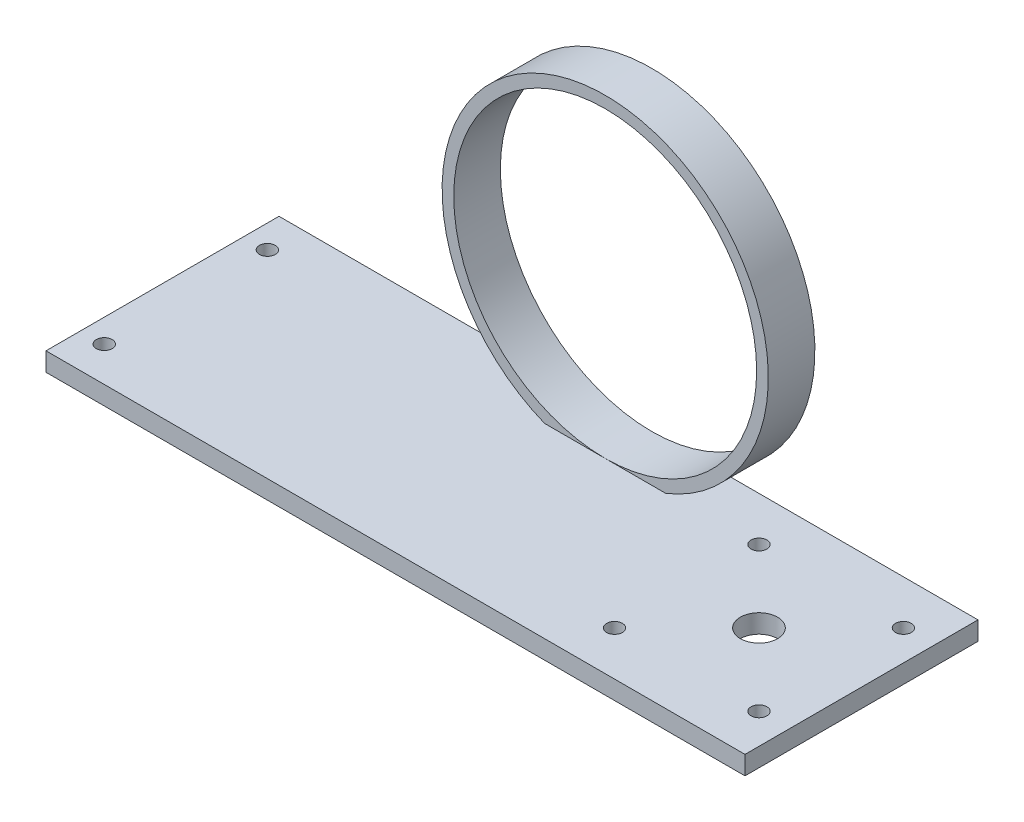
ISO-10303-21;
HEADER;
FILE_DESCRIPTION(('STEP AP214'),'2;1');
FILE_NAME('part.step','',(''),(''),'','','');
FILE_SCHEMA(('AUTOMOTIVE_DESIGN { 1 0 10303 214 1 1 1 1 }'));
ENDSEC;
DATA;
#1=APPLICATION_CONTEXT('core data for automotive mechanical design processes');
#2=APPLICATION_PROTOCOL_DEFINITION('international standard','automotive_design',2000,#1);
#3=PRODUCT_CONTEXT('',#1,'mechanical');
#4=PRODUCT('Part','Part','',(#3));
#5=PRODUCT_RELATED_PRODUCT_CATEGORY('part','',(#4));
#6=PRODUCT_DEFINITION_FORMATION('','',#4);
#7=PRODUCT_DEFINITION_CONTEXT('part definition',#1,'design');
#8=PRODUCT_DEFINITION('design','',#6,#7);
#9=PRODUCT_DEFINITION_SHAPE('','',#8);
#10=(LENGTH_UNIT() NAMED_UNIT(*) SI_UNIT(.MILLI.,.METRE.));
#11=(NAMED_UNIT(*) PLANE_ANGLE_UNIT() SI_UNIT($,.RADIAN.));
#12=(NAMED_UNIT(*) SI_UNIT($,.STERADIAN.) SOLID_ANGLE_UNIT());
#13=UNCERTAINTY_MEASURE_WITH_UNIT(LENGTH_MEASURE(1.E-05),#10,'distance_accuracy_value','');
#14=(GEOMETRIC_REPRESENTATION_CONTEXT(3) GLOBAL_UNCERTAINTY_ASSIGNED_CONTEXT((#13)) GLOBAL_UNIT_ASSIGNED_CONTEXT((#10,
#11,#12)) REPRESENTATION_CONTEXT('',''));
#15=CARTESIAN_POINT('',(0.,0.,0.));
#16=DIRECTION('',(0.,0.,1.));
#17=DIRECTION('',(1.,0.,0.));
#18=AXIS2_PLACEMENT_3D('',#15,#16,#17);
#19=CARTESIAN_POINT('',(0.,0.,10.));
#20=DIRECTION('',(0.,0.,1.));
#21=DIRECTION('',(1.,0.,0.));
#22=AXIS2_PLACEMENT_3D('',#19,#20,#21);
#23=PLANE('',#22);
#24=DIRECTION('',(-1.,0.,0.));
#25=VECTOR('',#24,1.);
#26=CARTESIAN_POINT('',(0.,-32.5,10.));
#27=LINE('',#26,#25);
#28=CARTESIAN_POINT('',(12.9903810567666,-32.5,10.));
#29=VERTEX_POINT('',#28);
#30=CARTESIAN_POINT('',(0.,-32.5,10.));
#31=VERTEX_POINT('',#30);
#32=EDGE_CURVE('E60',#29,#31,#27,.T.);
#33=ORIENTED_EDGE('',*,*,#32,.F.);
#34=CARTESIAN_POINT('',(0.,0.,10.));
#35=DIRECTION('',(0.,0.,1.));
#36=DIRECTION('',(1.,0.,0.));
#37=AXIS2_PLACEMENT_3D('',#34,#35,#36);
#38=CIRCLE('',#37,35.);
#39=CARTESIAN_POINT('',(-12.9903810567666,-32.5,10.));
#40=VERTEX_POINT('',#39);
#41=EDGE_CURVE('E11',#29,#40,#38,.T.);
#42=ORIENTED_EDGE('',*,*,#41,.T.);
#43=EDGE_CURVE('E139',#31,#40,#27,.T.);
#44=ORIENTED_EDGE('',*,*,#43,.F.);
#45=CARTESIAN_POINT('',(0.,0.,10.));
#46=DIRECTION('',(0.,0.,1.));
#47=DIRECTION('',(1.,0.,0.));
#48=AXIS2_PLACEMENT_3D('',#45,#46,#47);
#49=CIRCLE('',#48,32.5);
#50=EDGE_CURVE('E149',#31,#31,#49,.T.);
#51=ORIENTED_EDGE('',*,*,#50,.F.);
#52=EDGE_LOOP('',(#33,#42,#44,#51));
#53=FACE_BOUND('',#52,.T.);
#54=ADVANCED_FACE('F39',(#53),#23,.T.);
#55=CARTESIAN_POINT('',(0.,0.,0.));
#56=DIRECTION('',(0.,0.,1.));
#57=DIRECTION('',(1.,0.,0.));
#58=AXIS2_PLACEMENT_3D('',#55,#56,#57);
#59=PLANE('',#58);
#60=CARTESIAN_POINT('',(0.,0.,0.));
#61=DIRECTION('',(0.,0.,1.));
#62=DIRECTION('',(1.,0.,0.));
#63=AXIS2_PLACEMENT_3D('',#60,#61,#62);
#64=CIRCLE('',#63,32.5);
#65=CARTESIAN_POINT('',(32.5,0.,0.));
#66=VERTEX_POINT('',#65);
#67=EDGE_CURVE('E152',#66,#66,#64,.T.);
#68=ORIENTED_EDGE('',*,*,#67,.T.);
#69=EDGE_LOOP('',(#68));
#70=FACE_BOUND('',#69,.T.);
#71=CARTESIAN_POINT('',(0.,0.,0.));
#72=DIRECTION('',(0.,0.,1.));
#73=DIRECTION('',(1.,0.,0.));
#74=AXIS2_PLACEMENT_3D('',#71,#72,#73);
#75=CIRCLE('',#74,35.);
#76=CARTESIAN_POINT('',(12.9903810567666,-32.5,0.));
#77=VERTEX_POINT('',#76);
#78=CARTESIAN_POINT('',(-12.9903810567666,-32.5,0.));
#79=VERTEX_POINT('',#78);
#80=EDGE_CURVE('E43',#77,#79,#75,.T.);
#81=ORIENTED_EDGE('',*,*,#80,.F.);
#82=DIRECTION('',(1.,0.,0.));
#83=VECTOR('',#82,1.);
#84=CARTESIAN_POINT('',(0.,-32.5,0.));
#85=LINE('',#84,#83);
#86=CARTESIAN_POINT('',(70.,-32.5,0.));
#87=VERTEX_POINT('',#86);
#88=EDGE_CURVE('E131',#77,#87,#85,.T.);
#89=ORIENTED_EDGE('',*,*,#88,.T.);
#90=DIRECTION('',(0.,-1.,0.));
#91=VECTOR('',#90,1.);
#92=CARTESIAN_POINT('',(70.,-32.5,0.));
#93=LINE('',#92,#91);
#94=CARTESIAN_POINT('',(70.,-36.5,0.));
#95=VERTEX_POINT('',#94);
#96=EDGE_CURVE('E115',#87,#95,#93,.T.);
#97=ORIENTED_EDGE('',*,*,#96,.T.);
#98=DIRECTION('',(-1.,0.,0.));
#99=VECTOR('',#98,1.);
#100=CARTESIAN_POINT('',(70.,-36.5,0.));
#101=LINE('',#100,#99);
#102=CARTESIAN_POINT('',(-80.,-36.5,0.));
#103=VERTEX_POINT('',#102);
#104=EDGE_CURVE('E133',#95,#103,#101,.T.);
#105=ORIENTED_EDGE('',*,*,#104,.T.);
#106=DIRECTION('',(0.,1.,0.));
#107=VECTOR('',#106,1.);
#108=CARTESIAN_POINT('',(-80.,-32.5,0.));
#109=LINE('',#108,#107);
#110=CARTESIAN_POINT('',(-80.,-32.5,0.));
#111=VERTEX_POINT('',#110);
#112=EDGE_CURVE('E109',#103,#111,#109,.T.);
#113=ORIENTED_EDGE('',*,*,#112,.T.);
#114=EDGE_CURVE('E128',#111,#79,#85,.T.);
#115=ORIENTED_EDGE('',*,*,#114,.T.);
#116=EDGE_LOOP('',(#81,#89,#97,#105,#113,#115));
#117=FACE_BOUND('',#116,.T.);
#118=ADVANCED_FACE('F168',(#70,#117),#59,.F.);
#119=CARTESIAN_POINT('',(0.,0.,10.));
#120=DIRECTION('',(0.,0.,-1.));
#121=DIRECTION('',(-1.,0.,0.));
#122=AXIS2_PLACEMENT_3D('',#119,#120,#121);
#123=CYLINDRICAL_SURFACE('',#122,35.);
#124=ORIENTED_EDGE('',*,*,#41,.F.);
#125=DIRECTION('',(0.,0.,-1.));
#126=VECTOR('',#125,1.);
#127=CARTESIAN_POINT('',(12.9903810567666,-32.5,10.));
#128=LINE('',#127,#126);
#129=EDGE_CURVE('E147',#29,#77,#128,.T.);
#130=ORIENTED_EDGE('',*,*,#129,.T.);
#131=ORIENTED_EDGE('',*,*,#80,.T.);
#132=DIRECTION('',(0.,0.,-1.));
#133=VECTOR('',#132,1.);
#134=CARTESIAN_POINT('',(-12.9903810567666,-32.5,10.));
#135=LINE('',#134,#133);
#136=EDGE_CURVE('E145',#79,#40,#135,.F.);
#137=ORIENTED_EDGE('',*,*,#136,.T.);
#138=EDGE_LOOP('',(#124,#130,#131,#137));
#139=FACE_BOUND('',#138,.T.);
#140=ADVANCED_FACE('F41',(#139),#123,.T.);
#141=CARTESIAN_POINT('',(0.,0.,10.));
#142=DIRECTION('',(0.,0.,-1.));
#143=DIRECTION('',(-1.,0.,0.));
#144=AXIS2_PLACEMENT_3D('',#141,#142,#143);
#145=CYLINDRICAL_SURFACE('',#144,32.5);
#146=ORIENTED_EDGE('',*,*,#67,.F.);
#147=EDGE_LOOP('',(#146));
#148=FACE_BOUND('',#147,.T.);
#149=ORIENTED_EDGE('',*,*,#50,.T.);
#150=EDGE_LOOP('',(#149));
#151=FACE_BOUND('',#150,.T.);
#152=ADVANCED_FACE('F157',(#148,#151),#145,.F.);
#153=CARTESIAN_POINT('',(0.,-32.5,50.));
#154=DIRECTION('',(0.,1.,0.));
#155=DIRECTION('',(-1.,0.,0.));
#156=AXIS2_PLACEMENT_3D('',#153,#154,#155);
#157=PLANE('',#156);
#158=CARTESIAN_POINT('',(-75.,-32.5,42.5));
#159=DIRECTION('',(0.,1.,0.));
#160=DIRECTION('',(-1.,0.,0.));
#161=AXIS2_PLACEMENT_3D('',#158,#159,#160);
#162=CIRCLE('',#161,1.7);
#163=CARTESIAN_POINT('',(-76.7,-32.5,42.5));
#164=VERTEX_POINT('',#163);
#165=EDGE_CURVE('E228',#164,#164,#162,.F.);
#166=ORIENTED_EDGE('',*,*,#165,.T.);
#167=EDGE_LOOP('',(#166));
#168=FACE_BOUND('',#167,.T.);
#169=CARTESIAN_POINT('',(-75.,-32.5,7.49999999999999));
#170=DIRECTION('',(0.,1.,0.));
#171=DIRECTION('',(-1.,0.,0.));
#172=AXIS2_PLACEMENT_3D('',#169,#170,#171);
#173=CIRCLE('',#172,1.7);
#174=CARTESIAN_POINT('',(-76.7,-32.5,7.49999999999999));
#175=VERTEX_POINT('',#174);
#176=EDGE_CURVE('E236',#175,#175,#173,.F.);
#177=ORIENTED_EDGE('',*,*,#176,.T.);
#178=EDGE_LOOP('',(#177));
#179=FACE_BOUND('',#178,.T.);
#180=CARTESIAN_POINT('',(63.5,-32.5,9.500000000001));
#181=DIRECTION('',(0.,1.,0.));
#182=DIRECTION('',(-1.,0.,0.));
#183=AXIS2_PLACEMENT_3D('',#180,#181,#182);
#184=CIRCLE('',#183,1.7);
#185=CARTESIAN_POINT('',(61.8,-32.5,9.500000000001));
#186=VERTEX_POINT('',#185);
#187=EDGE_CURVE('E247',#186,#186,#184,.F.);
#188=ORIENTED_EDGE('',*,*,#187,.T.);
#189=EDGE_LOOP('',(#188));
#190=FACE_BOUND('',#189,.T.);
#191=CARTESIAN_POINT('',(32.5,-32.5,40.499999999999));
#192=DIRECTION('',(0.,1.,0.));
#193=DIRECTION('',(-1.,0.,0.));
#194=AXIS2_PLACEMENT_3D('',#191,#192,#193);
#195=CIRCLE('',#194,1.7);
#196=CARTESIAN_POINT('',(30.8,-32.5,40.499999999999));
#197=VERTEX_POINT('',#196);
#198=EDGE_CURVE('E254',#197,#197,#195,.F.);
#199=ORIENTED_EDGE('',*,*,#198,.T.);
#200=EDGE_LOOP('',(#199));
#201=FACE_BOUND('',#200,.T.);
#202=CARTESIAN_POINT('',(32.5,-32.5,9.500000000001));
#203=DIRECTION('',(0.,1.,0.));
#204=DIRECTION('',(-1.,0.,0.));
#205=AXIS2_PLACEMENT_3D('',#202,#203,#204);
#206=CIRCLE('',#205,1.7);
#207=CARTESIAN_POINT('',(30.8,-32.5,9.500000000001));
#208=VERTEX_POINT('',#207);
#209=EDGE_CURVE('E234',#208,#208,#206,.F.);
#210=ORIENTED_EDGE('',*,*,#209,.T.);
#211=EDGE_LOOP('',(#210));
#212=FACE_BOUND('',#211,.T.);
#213=CARTESIAN_POINT('',(63.5,-32.5,40.499999999999));
#214=DIRECTION('',(0.,1.,0.));
#215=DIRECTION('',(-1.,0.,0.));
#216=AXIS2_PLACEMENT_3D('',#213,#214,#215);
#217=CIRCLE('',#216,1.7);
#218=CARTESIAN_POINT('',(61.8,-32.5,40.499999999999));
#219=VERTEX_POINT('',#218);
#220=EDGE_CURVE('E250',#219,#219,#217,.F.);
#221=ORIENTED_EDGE('',*,*,#220,.T.);
#222=EDGE_LOOP('',(#221));
#223=FACE_BOUND('',#222,.T.);
#224=CARTESIAN_POINT('',(48.,-32.5,25.));
#225=DIRECTION('',(0.,1.,0.));
#226=DIRECTION('',(-1.,0.,0.));
#227=AXIS2_PLACEMENT_3D('',#224,#225,#226);
#228=CIRCLE('',#227,4.00000000000001);
#229=CARTESIAN_POINT('',(44.,-32.5,25.));
#230=VERTEX_POINT('',#229);
#231=EDGE_CURVE('E265',#230,#230,#228,.T.);
#232=ORIENTED_EDGE('',*,*,#231,.F.);
#233=EDGE_LOOP('',(#232));
#234=FACE_BOUND('',#233,.T.);
#235=ORIENTED_EDGE('',*,*,#129,.F.);
#236=ORIENTED_EDGE('',*,*,#32,.T.);
#237=ORIENTED_EDGE('',*,*,#43,.T.);
#238=ORIENTED_EDGE('',*,*,#136,.F.);
#239=ORIENTED_EDGE('',*,*,#114,.F.);
#240=DIRECTION('',(0.,0.,-1.));
#241=VECTOR('',#240,1.);
#242=CARTESIAN_POINT('',(-80.,-32.5,50.));
#243=LINE('',#242,#241);
#244=CARTESIAN_POINT('',(-80.,-32.5,50.));
#245=VERTEX_POINT('',#244);
#246=EDGE_CURVE('E103',#245,#111,#243,.T.);
#247=ORIENTED_EDGE('',*,*,#246,.F.);
#248=DIRECTION('',(1.,0.,0.));
#249=VECTOR('',#248,1.);
#250=CARTESIAN_POINT('',(0.,-32.5,50.));
#251=LINE('',#250,#249);
#252=CARTESIAN_POINT('',(70.,-32.5,50.));
#253=VERTEX_POINT('',#252);
#254=EDGE_CURVE('E95',#245,#253,#251,.T.);
#255=ORIENTED_EDGE('',*,*,#254,.T.);
#256=DIRECTION('',(0.,0.,-1.));
#257=VECTOR('',#256,1.);
#258=CARTESIAN_POINT('',(70.,-32.5,50.));
#259=LINE('',#258,#257);
#260=EDGE_CURVE('E100',#253,#87,#259,.T.);
#261=ORIENTED_EDGE('',*,*,#260,.T.);
#262=ORIENTED_EDGE('',*,*,#88,.F.);
#263=EDGE_LOOP('',(#235,#236,#237,#238,#239,#247,#255,#261,#262));
#264=FACE_BOUND('',#263,.T.);
#265=ADVANCED_FACE('F98',(#168,#179,#190,#201,#212,#223,#234,#264),#157,.T.);
#266=CARTESIAN_POINT('',(-80.,-32.5,50.));
#267=DIRECTION('',(-1.,0.,0.));
#268=DIRECTION('',(0.,-1.,0.));
#269=AXIS2_PLACEMENT_3D('',#266,#267,#268);
#270=PLANE('',#269);
#271=ORIENTED_EDGE('',*,*,#112,.F.);
#272=DIRECTION('',(0.,0.,-1.));
#273=VECTOR('',#272,1.);
#274=CARTESIAN_POINT('',(-80.,-36.5,50.));
#275=LINE('',#274,#273);
#276=CARTESIAN_POINT('',(-80.,-36.5,50.));
#277=VERTEX_POINT('',#276);
#278=EDGE_CURVE('E140',#277,#103,#275,.T.);
#279=ORIENTED_EDGE('',*,*,#278,.F.);
#280=DIRECTION('',(0.,1.,0.));
#281=VECTOR('',#280,1.);
#282=CARTESIAN_POINT('',(-80.,-32.5,50.));
#283=LINE('',#282,#281);
#284=EDGE_CURVE('E117',#277,#245,#283,.T.);
#285=ORIENTED_EDGE('',*,*,#284,.T.);
#286=ORIENTED_EDGE('',*,*,#246,.T.);
#287=EDGE_LOOP('',(#271,#279,#285,#286));
#288=FACE_BOUND('',#287,.T.);
#289=ADVANCED_FACE('F165',(#288),#270,.T.);
#290=CARTESIAN_POINT('',(70.,-36.5,50.));
#291=DIRECTION('',(0.,-1.,0.));
#292=DIRECTION('',(0.,0.,-1.));
#293=AXIS2_PLACEMENT_3D('',#290,#291,#292);
#294=PLANE('',#293);
#295=CARTESIAN_POINT('',(-75.,-36.5,42.5));
#296=DIRECTION('',(0.,-1.,0.));
#297=DIRECTION('',(0.,0.,-1.));
#298=AXIS2_PLACEMENT_3D('',#295,#296,#297);
#299=CIRCLE('',#298,1.7);
#300=CARTESIAN_POINT('',(-75.,-36.5,40.8));
#301=VERTEX_POINT('',#300);
#302=EDGE_CURVE('E230',#301,#301,#299,.T.);
#303=ORIENTED_EDGE('',*,*,#302,.F.);
#304=EDGE_LOOP('',(#303));
#305=FACE_BOUND('',#304,.T.);
#306=CARTESIAN_POINT('',(-75.,-36.5,7.49999999999999));
#307=DIRECTION('',(0.,-1.,0.));
#308=DIRECTION('',(0.,0.,-1.));
#309=AXIS2_PLACEMENT_3D('',#306,#307,#308);
#310=CIRCLE('',#309,1.7);
#311=CARTESIAN_POINT('',(-75.,-36.5,5.79999999999999));
#312=VERTEX_POINT('',#311);
#313=EDGE_CURVE('E241',#312,#312,#310,.T.);
#314=ORIENTED_EDGE('',*,*,#313,.F.);
#315=EDGE_LOOP('',(#314));
#316=FACE_BOUND('',#315,.T.);
#317=CARTESIAN_POINT('',(63.5,-36.5,9.500000000001));
#318=DIRECTION('',(0.,-1.,0.));
#319=DIRECTION('',(0.,0.,-1.));
#320=AXIS2_PLACEMENT_3D('',#317,#318,#319);
#321=CIRCLE('',#320,1.7);
#322=CARTESIAN_POINT('',(63.5,-36.5,7.800000000001));
#323=VERTEX_POINT('',#322);
#324=EDGE_CURVE('E251',#323,#323,#321,.T.);
#325=ORIENTED_EDGE('',*,*,#324,.F.);
#326=EDGE_LOOP('',(#325));
#327=FACE_BOUND('',#326,.T.);
#328=CARTESIAN_POINT('',(32.5,-36.5,40.499999999999));
#329=DIRECTION('',(0.,-1.,0.));
#330=DIRECTION('',(0.,0.,-1.));
#331=AXIS2_PLACEMENT_3D('',#328,#329,#330);
#332=CIRCLE('',#331,1.7);
#333=CARTESIAN_POINT('',(32.5,-36.5,38.799999999999));
#334=VERTEX_POINT('',#333);
#335=EDGE_CURVE('E245',#334,#334,#332,.T.);
#336=ORIENTED_EDGE('',*,*,#335,.F.);
#337=EDGE_LOOP('',(#336));
#338=FACE_BOUND('',#337,.T.);
#339=CARTESIAN_POINT('',(32.5,-36.5,9.500000000001));
#340=DIRECTION('',(0.,-1.,0.));
#341=DIRECTION('',(0.,0.,-1.));
#342=AXIS2_PLACEMENT_3D('',#339,#340,#341);
#343=CIRCLE('',#342,1.7);
#344=CARTESIAN_POINT('',(32.5,-36.5,7.800000000001));
#345=VERTEX_POINT('',#344);
#346=EDGE_CURVE('E231',#345,#345,#343,.T.);
#347=ORIENTED_EDGE('',*,*,#346,.F.);
#348=EDGE_LOOP('',(#347));
#349=FACE_BOUND('',#348,.T.);
#350=CARTESIAN_POINT('',(63.5,-36.5,40.499999999999));
#351=DIRECTION('',(0.,-1.,0.));
#352=DIRECTION('',(0.,0.,-1.));
#353=AXIS2_PLACEMENT_3D('',#350,#351,#352);
#354=CIRCLE('',#353,1.7);
#355=CARTESIAN_POINT('',(63.5,-36.5,38.799999999999));
#356=VERTEX_POINT('',#355);
#357=EDGE_CURVE('E259',#356,#356,#354,.T.);
#358=ORIENTED_EDGE('',*,*,#357,.F.);
#359=EDGE_LOOP('',(#358));
#360=FACE_BOUND('',#359,.T.);
#361=CARTESIAN_POINT('',(48.,-36.5,25.));
#362=DIRECTION('',(0.,-1.,0.));
#363=DIRECTION('',(0.,0.,-1.));
#364=AXIS2_PLACEMENT_3D('',#361,#362,#363);
#365=CIRCLE('',#364,4.00000000000001);
#366=CARTESIAN_POINT('',(48.,-36.5,21.));
#367=VERTEX_POINT('',#366);
#368=EDGE_CURVE('E262',#367,#367,#365,.F.);
#369=ORIENTED_EDGE('',*,*,#368,.T.);
#370=EDGE_LOOP('',(#369));
#371=FACE_BOUND('',#370,.T.);
#372=ORIENTED_EDGE('',*,*,#104,.F.);
#373=DIRECTION('',(0.,0.,-1.));
#374=VECTOR('',#373,1.);
#375=CARTESIAN_POINT('',(70.,-36.5,50.));
#376=LINE('',#375,#374);
#377=CARTESIAN_POINT('',(70.,-36.5,50.));
#378=VERTEX_POINT('',#377);
#379=EDGE_CURVE('E116',#378,#95,#376,.T.);
#380=ORIENTED_EDGE('',*,*,#379,.F.);
#381=DIRECTION('',(-1.,0.,0.));
#382=VECTOR('',#381,1.);
#383=CARTESIAN_POINT('',(70.,-36.5,50.));
#384=LINE('',#383,#382);
#385=EDGE_CURVE('E122',#378,#277,#384,.T.);
#386=ORIENTED_EDGE('',*,*,#385,.T.);
#387=ORIENTED_EDGE('',*,*,#278,.T.);
#388=EDGE_LOOP('',(#372,#380,#386,#387));
#389=FACE_BOUND('',#388,.T.);
#390=ADVANCED_FACE('F181',(#305,#316,#327,#338,#349,#360,#371,#389),#294,.T.);
#391=CARTESIAN_POINT('',(70.,-32.5,50.));
#392=DIRECTION('',(1.,0.,0.));
#393=DIRECTION('',(0.,0.,-1.));
#394=AXIS2_PLACEMENT_3D('',#391,#392,#393);
#395=PLANE('',#394);
#396=ORIENTED_EDGE('',*,*,#96,.F.);
#397=ORIENTED_EDGE('',*,*,#260,.F.);
#398=DIRECTION('',(0.,-1.,0.));
#399=VECTOR('',#398,1.);
#400=CARTESIAN_POINT('',(70.,-32.5,50.));
#401=LINE('',#400,#399);
#402=EDGE_CURVE('E108',#253,#378,#401,.T.);
#403=ORIENTED_EDGE('',*,*,#402,.T.);
#404=ORIENTED_EDGE('',*,*,#379,.T.);
#405=EDGE_LOOP('',(#396,#397,#403,#404));
#406=FACE_BOUND('',#405,.T.);
#407=ADVANCED_FACE('F113',(#406),#395,.T.);
#408=CARTESIAN_POINT('',(0.,0.,50.));
#409=DIRECTION('',(0.,0.,1.));
#410=DIRECTION('',(1.,0.,0.));
#411=AXIS2_PLACEMENT_3D('',#408,#409,#410);
#412=PLANE('',#411);
#413=ORIENTED_EDGE('',*,*,#254,.F.);
#414=ORIENTED_EDGE('',*,*,#284,.F.);
#415=ORIENTED_EDGE('',*,*,#385,.F.);
#416=ORIENTED_EDGE('',*,*,#402,.F.);
#417=EDGE_LOOP('',(#413,#414,#415,#416));
#418=FACE_BOUND('',#417,.T.);
#419=ADVANCED_FACE('F120',(#418),#412,.T.);
#420=CARTESIAN_POINT('',(48.,-36.501,25.));
#421=DIRECTION('',(0.,1.,0.));
#422=DIRECTION('',(-1.,0.,0.));
#423=AXIS2_PLACEMENT_3D('',#420,#421,#422);
#424=CYLINDRICAL_SURFACE('',#423,4.00000000000001);
#425=ORIENTED_EDGE('',*,*,#368,.F.);
#426=EDGE_LOOP('',(#425));
#427=FACE_BOUND('',#426,.T.);
#428=ORIENTED_EDGE('',*,*,#231,.T.);
#429=EDGE_LOOP('',(#428));
#430=FACE_BOUND('',#429,.T.);
#431=ADVANCED_FACE('F196',(#427,#430),#424,.F.);
#432=CARTESIAN_POINT('',(63.5,35.001,40.499999999999));
#433=DIRECTION('',(0.,-1.,0.));
#434=DIRECTION('',(0.,0.,-1.));
#435=AXIS2_PLACEMENT_3D('',#432,#433,#434);
#436=CYLINDRICAL_SURFACE('',#435,1.7);
#437=ORIENTED_EDGE('',*,*,#220,.F.);
#438=EDGE_LOOP('',(#437));
#439=FACE_BOUND('',#438,.T.);
#440=ORIENTED_EDGE('',*,*,#357,.T.);
#441=EDGE_LOOP('',(#440));
#442=FACE_BOUND('',#441,.T.);
#443=ADVANCED_FACE('F199',(#439,#442),#436,.F.);
#444=CARTESIAN_POINT('',(32.5,35.001,9.500000000001));
#445=DIRECTION('',(0.,-1.,0.));
#446=DIRECTION('',(0.,0.,-1.));
#447=AXIS2_PLACEMENT_3D('',#444,#445,#446);
#448=CYLINDRICAL_SURFACE('',#447,1.7);
#449=ORIENTED_EDGE('',*,*,#209,.F.);
#450=EDGE_LOOP('',(#449));
#451=FACE_BOUND('',#450,.T.);
#452=ORIENTED_EDGE('',*,*,#346,.T.);
#453=EDGE_LOOP('',(#452));
#454=FACE_BOUND('',#453,.T.);
#455=ADVANCED_FACE('F203',(#451,#454),#448,.F.);
#456=CARTESIAN_POINT('',(32.5,35.001,40.499999999999));
#457=DIRECTION('',(0.,-1.,0.));
#458=DIRECTION('',(0.,0.,-1.));
#459=AXIS2_PLACEMENT_3D('',#456,#457,#458);
#460=CYLINDRICAL_SURFACE('',#459,1.7);
#461=ORIENTED_EDGE('',*,*,#198,.F.);
#462=EDGE_LOOP('',(#461));
#463=FACE_BOUND('',#462,.T.);
#464=ORIENTED_EDGE('',*,*,#335,.T.);
#465=EDGE_LOOP('',(#464));
#466=FACE_BOUND('',#465,.T.);
#467=ADVANCED_FACE('F205',(#463,#466),#460,.F.);
#468=CARTESIAN_POINT('',(63.5,35.001,9.500000000001));
#469=DIRECTION('',(0.,-1.,0.));
#470=DIRECTION('',(0.,0.,-1.));
#471=AXIS2_PLACEMENT_3D('',#468,#469,#470);
#472=CYLINDRICAL_SURFACE('',#471,1.7);
#473=ORIENTED_EDGE('',*,*,#187,.F.);
#474=EDGE_LOOP('',(#473));
#475=FACE_BOUND('',#474,.T.);
#476=ORIENTED_EDGE('',*,*,#324,.T.);
#477=EDGE_LOOP('',(#476));
#478=FACE_BOUND('',#477,.T.);
#479=ADVANCED_FACE('F208',(#475,#478),#472,.F.);
#480=CARTESIAN_POINT('',(-75.,35.001,7.49999999999999));
#481=DIRECTION('',(0.,-1.,0.));
#482=DIRECTION('',(0.,0.,-1.));
#483=AXIS2_PLACEMENT_3D('',#480,#481,#482);
#484=CYLINDRICAL_SURFACE('',#483,1.7);
#485=ORIENTED_EDGE('',*,*,#176,.F.);
#486=EDGE_LOOP('',(#485));
#487=FACE_BOUND('',#486,.T.);
#488=ORIENTED_EDGE('',*,*,#313,.T.);
#489=EDGE_LOOP('',(#488));
#490=FACE_BOUND('',#489,.T.);
#491=ADVANCED_FACE('F212',(#487,#490),#484,.F.);
#492=CARTESIAN_POINT('',(-75.,35.001,42.5));
#493=DIRECTION('',(0.,-1.,0.));
#494=DIRECTION('',(0.,0.,-1.));
#495=AXIS2_PLACEMENT_3D('',#492,#493,#494);
#496=CYLINDRICAL_SURFACE('',#495,1.7);
#497=ORIENTED_EDGE('',*,*,#165,.F.);
#498=EDGE_LOOP('',(#497));
#499=FACE_BOUND('',#498,.T.);
#500=ORIENTED_EDGE('',*,*,#302,.T.);
#501=EDGE_LOOP('',(#500));
#502=FACE_BOUND('',#501,.T.);
#503=ADVANCED_FACE('F219',(#499,#502),#496,.F.);
#504=CLOSED_SHELL('',(#54,#118,#140,#152,#265,#289,#390,#407,#419,#431,#443,#455,#467,#479,#491,#503));
#505=MANIFOLD_SOLID_BREP('B2',#504);
#506=ADVANCED_BREP_SHAPE_REPRESENTATION('',(#18,#505),#14);
#507=SHAPE_DEFINITION_REPRESENTATION(#9,#506);
ENDSEC;
END-ISO-10303-21;
